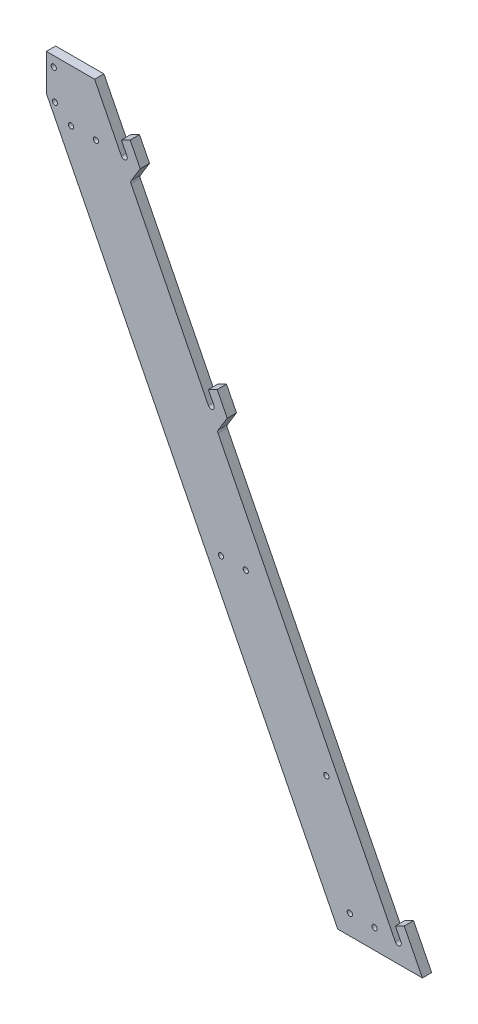
ISO-10303-21;
HEADER;
FILE_DESCRIPTION(('STEP AP214'),'2;1');
FILE_NAME('part.step','',(''),(''),'','','');
FILE_SCHEMA(('AUTOMOTIVE_DESIGN { 1 0 10303 214 1 1 1 1 }'));
ENDSEC;
DATA;
#1=APPLICATION_CONTEXT('core data for automotive mechanical design processes');
#2=APPLICATION_PROTOCOL_DEFINITION('international standard','automotive_design',2000,#1);
#3=PRODUCT_CONTEXT('',#1,'mechanical');
#4=PRODUCT('Part','Part','',(#3));
#5=PRODUCT_RELATED_PRODUCT_CATEGORY('part','',(#4));
#6=PRODUCT_DEFINITION_FORMATION('','',#4);
#7=PRODUCT_DEFINITION_CONTEXT('part definition',#1,'design');
#8=PRODUCT_DEFINITION('design','',#6,#7);
#9=PRODUCT_DEFINITION_SHAPE('','',#8);
#10=(LENGTH_UNIT() NAMED_UNIT(*) SI_UNIT(.MILLI.,.METRE.));
#11=(NAMED_UNIT(*) PLANE_ANGLE_UNIT() SI_UNIT($,.RADIAN.));
#12=(NAMED_UNIT(*) SI_UNIT($,.STERADIAN.) SOLID_ANGLE_UNIT());
#13=UNCERTAINTY_MEASURE_WITH_UNIT(LENGTH_MEASURE(1.E-05),#10,'distance_accuracy_value','');
#14=(GEOMETRIC_REPRESENTATION_CONTEXT(3) GLOBAL_UNCERTAINTY_ASSIGNED_CONTEXT((#13)) GLOBAL_UNIT_ASSIGNED_CONTEXT((#10,
#11,#12)) REPRESENTATION_CONTEXT('',''));
#15=CARTESIAN_POINT('',(0.,0.,0.));
#16=DIRECTION('',(0.,0.,1.));
#17=DIRECTION('',(1.,0.,0.));
#18=AXIS2_PLACEMENT_3D('',#15,#16,#17);
#19=CARTESIAN_POINT('',(0.,0.,5.953125));
#20=DIRECTION('',(-0.892982258418845,-0.450091864122402,0.));
#21=DIRECTION('',(0.450091864122402,-0.892982258418845,0.));
#22=AXIS2_PLACEMENT_3D('',#19,#20,#21);
#23=PLANE('',#22);
#24=DIRECTION('',(-0.450091864122402,0.892982258418845,0.));
#25=VECTOR('',#24,1.);
#26=CARTESIAN_POINT('',(0.,0.,5.953125));
#27=LINE('',#26,#25);
#28=CARTESIAN_POINT('',(-362.577999953873,719.354751908484,5.953125));
#29=VERTEX_POINT('',#28);
#30=CARTESIAN_POINT('',(-396.875,787.4,5.953125));
#31=VERTEX_POINT('',#30);
#32=EDGE_CURVE('E259',#29,#31,#27,.T.);
#33=ORIENTED_EDGE('',*,*,#32,.F.);
#34=DIRECTION('',(0.,0.,1.));
#35=VECTOR('',#34,1.);
#36=CARTESIAN_POINT('',(-362.577999953873,719.354751908484,-64.1233525596098));
#37=LINE('',#36,#35);
#38=CARTESIAN_POINT('',(-362.577999953873,719.354751908484,-5.953125));
#39=VERTEX_POINT('',#38);
#40=EDGE_CURVE('E213',#39,#29,#37,.T.);
#41=ORIENTED_EDGE('',*,*,#40,.F.);
#42=DIRECTION('',(-0.450091864122402,0.892982258418845,0.));
#43=VECTOR('',#42,1.);
#44=CARTESIAN_POINT('',(0.,0.,-5.953125));
#45=LINE('',#44,#43);
#46=CARTESIAN_POINT('',(-396.875,787.4,-5.953125));
#47=VERTEX_POINT('',#46);
#48=EDGE_CURVE('E273',#39,#47,#45,.T.);
#49=ORIENTED_EDGE('',*,*,#48,.T.);
#50=DIRECTION('',(0.,0.,-1.));
#51=VECTOR('',#50,1.);
#52=CARTESIAN_POINT('',(-396.875,787.4,5.953125));
#53=LINE('',#52,#51);
#54=EDGE_CURVE('E284',#31,#47,#53,.T.);
#55=ORIENTED_EDGE('',*,*,#54,.F.);
#56=EDGE_LOOP('',(#33,#41,#49,#55));
#57=FACE_BOUND('',#56,.T.);
#58=ADVANCED_FACE('F33',(#57),#23,.F.);
#59=CARTESIAN_POINT('',(-251.11274980396,498.207695611057,-5.953125));
#60=VERTEX_POINT('',#59);
#61=CARTESIAN_POINT('',(-350.296018325224,694.987300357244,-5.953125));
#62=VERTEX_POINT('',#61);
#63=EDGE_CURVE('E278',#60,#62,#45,.T.);
#64=ORIENTED_EDGE('',*,*,#63,.T.);
#65=DIRECTION('',(0.,0.,1.));
#66=VECTOR('',#65,1.);
#67=CARTESIAN_POINT('',(-350.296018325224,694.987300357244,5.953125));
#68=LINE('',#67,#66);
#69=CARTESIAN_POINT('',(-350.296018325224,694.987300357244,5.953125));
#70=VERTEX_POINT('',#69);
#71=EDGE_CURVE('E292',#62,#70,#68,.T.);
#72=ORIENTED_EDGE('',*,*,#71,.T.);
#73=CARTESIAN_POINT('',(-251.11274980396,498.207695611057,5.953125));
#74=VERTEX_POINT('',#73);
#75=EDGE_CURVE('E265',#74,#70,#27,.T.);
#76=ORIENTED_EDGE('',*,*,#75,.F.);
#77=DIRECTION('',(0.,0.,1.));
#78=VECTOR('',#77,1.);
#79=CARTESIAN_POINT('',(-251.11274980396,498.207695611057,-64.1233525596098));
#80=LINE('',#79,#78);
#81=EDGE_CURVE('E249',#60,#74,#80,.T.);
#82=ORIENTED_EDGE('',*,*,#81,.F.);
#83=EDGE_LOOP('',(#64,#72,#76,#82));
#84=FACE_BOUND('',#83,.T.);
#85=ADVANCED_FACE('F508',(#84),#23,.F.);
#86=CARTESIAN_POINT('',(-482.207042469604,787.4,5.953125));
#87=DIRECTION('',(0.892982258418845,0.450091864122402,0.));
#88=DIRECTION('',(-0.450091864122402,0.892982258418845,0.));
#89=AXIS2_PLACEMENT_3D('',#86,#87,#88);
#90=PLANE('',#89);
#91=DIRECTION('',(0.450091864122402,-0.892982258418845,0.));
#92=VECTOR('',#91,1.);
#93=CARTESIAN_POINT('',(-482.207042469604,787.4,5.953125));
#94=LINE('',#93,#92);
#95=CARTESIAN_POINT('',(-458.7875,740.935627740305,5.953125));
#96=VERTEX_POINT('',#95);
#97=CARTESIAN_POINT('',(-85.332042469604,-1.09287578986539E-13,5.953125));
#98=VERTEX_POINT('',#97);
#99=EDGE_CURVE('E268',#96,#98,#94,.T.);
#100=ORIENTED_EDGE('',*,*,#99,.F.);
#101=DIRECTION('',(0.,0.,1.));
#102=VECTOR('',#101,1.);
#103=CARTESIAN_POINT('',(-458.7875,740.935627740305,-5.953125));
#104=LINE('',#103,#102);
#105=CARTESIAN_POINT('',(-458.7875,740.935627740305,-5.953125));
#106=VERTEX_POINT('',#105);
#107=EDGE_CURVE('E197',#106,#96,#104,.T.);
#108=ORIENTED_EDGE('',*,*,#107,.F.);
#109=DIRECTION('',(0.450091864122402,-0.892982258418845,0.));
#110=VECTOR('',#109,1.);
#111=CARTESIAN_POINT('',(-482.207042469604,787.4,-5.953125));
#112=LINE('',#111,#110);
#113=CARTESIAN_POINT('',(-85.332042469604,-1.09287578986539E-13,-5.953125));
#114=VERTEX_POINT('',#113);
#115=EDGE_CURVE('E260',#106,#114,#112,.T.);
#116=ORIENTED_EDGE('',*,*,#115,.T.);
#117=DIRECTION('',(0.,0.,-1.));
#118=VECTOR('',#117,1.);
#119=CARTESIAN_POINT('',(-85.332042469604,-1.09287578986539E-13,5.953125));
#120=LINE('',#119,#118);
#121=EDGE_CURVE('E270',#98,#114,#120,.T.);
#122=ORIENTED_EDGE('',*,*,#121,.F.);
#123=EDGE_LOOP('',(#100,#108,#116,#122));
#124=FACE_BOUND('',#123,.T.);
#125=ADVANCED_FACE('F473',(#124),#90,.F.);
#126=CARTESIAN_POINT('',(0.,0.,5.953125));
#127=DIRECTION('',(0.,1.,0.));
#128=DIRECTION('',(-1.,0.,0.));
#129=AXIS2_PLACEMENT_3D('',#126,#127,#128);
#130=PLANE('',#129);
#131=DIRECTION('',(1.,0.,0.));
#132=VECTOR('',#131,1.);
#133=CARTESIAN_POINT('',(0.,0.,-5.953125));
#134=LINE('',#133,#132);
#135=CARTESIAN_POINT('',(23.1107615021854,0.,-5.953125));
#136=VERTEX_POINT('',#135);
#137=EDGE_CURVE('E237',#114,#136,#134,.T.);
#138=ORIENTED_EDGE('',*,*,#137,.T.);
#139=DIRECTION('',(0.,0.,1.));
#140=VECTOR('',#139,1.);
#141=CARTESIAN_POINT('',(23.1107615021854,0.,-64.1233525596098));
#142=LINE('',#141,#140);
#143=CARTESIAN_POINT('',(23.1107615021854,0.,5.953125));
#144=VERTEX_POINT('',#143);
#145=EDGE_CURVE('E422',#136,#144,#142,.T.);
#146=ORIENTED_EDGE('',*,*,#145,.T.);
#147=DIRECTION('',(1.,0.,0.));
#148=VECTOR('',#147,1.);
#149=CARTESIAN_POINT('',(0.,0.,5.953125));
#150=LINE('',#149,#148);
#151=EDGE_CURVE('E257',#98,#144,#150,.T.);
#152=ORIENTED_EDGE('',*,*,#151,.F.);
#153=ORIENTED_EDGE('',*,*,#121,.T.);
#154=EDGE_LOOP('',(#138,#146,#152,#153));
#155=FACE_BOUND('',#154,.T.);
#156=ADVANCED_FACE('F476',(#155),#130,.F.);
#157=CARTESIAN_POINT('',(-11.432333348709,22.6817493638388,-5.953125));
#158=VERTEX_POINT('',#157);
#159=CARTESIAN_POINT('',(-238.830768175311,473.840244059817,-5.953125));
#160=VERTEX_POINT('',#159);
#161=EDGE_CURVE('E274',#158,#160,#45,.T.);
#162=ORIENTED_EDGE('',*,*,#161,.T.);
#163=DIRECTION('',(0.,0.,1.));
#164=VECTOR('',#163,1.);
#165=CARTESIAN_POINT('',(-238.830768175311,473.840244059817,5.953125));
#166=LINE('',#165,#164);
#167=CARTESIAN_POINT('',(-238.830768175311,473.840244059817,5.953125));
#168=VERTEX_POINT('',#167);
#169=EDGE_CURVE('E287',#160,#168,#166,.T.);
#170=ORIENTED_EDGE('',*,*,#169,.T.);
#171=CARTESIAN_POINT('',(-11.432333348709,22.6817493638387,5.953125));
#172=VERTEX_POINT('',#171);
#173=EDGE_CURVE('E261',#172,#168,#27,.T.);
#174=ORIENTED_EDGE('',*,*,#173,.F.);
#175=DIRECTION('',(0.,0.,1.));
#176=VECTOR('',#175,1.);
#177=CARTESIAN_POINT('',(-11.432333348709,22.6817493638388,-64.1233525596098));
#178=LINE('',#177,#176);
#179=EDGE_CURVE('E311',#158,#172,#178,.T.);
#180=ORIENTED_EDGE('',*,*,#179,.F.);
#181=EDGE_LOOP('',(#162,#170,#174,#180));
#182=FACE_BOUND('',#181,.T.);
#183=ADVANCED_FACE('F309',(#182),#23,.F.);
#184=CARTESIAN_POINT('',(-396.875,787.4,5.953125));
#185=DIRECTION('',(0.,-1.,0.));
#186=DIRECTION('',(1.,0.,0.));
#187=AXIS2_PLACEMENT_3D('',#184,#185,#186);
#188=PLANE('',#187);
#189=DIRECTION('',(-1.,0.,0.));
#190=VECTOR('',#189,1.);
#191=CARTESIAN_POINT('',(-396.875,787.4,-5.953125));
#192=LINE('',#191,#190);
#193=CARTESIAN_POINT('',(-458.7875,787.4,-5.953125));
#194=VERTEX_POINT('',#193);
#195=EDGE_CURVE('E277',#47,#194,#192,.T.);
#196=ORIENTED_EDGE('',*,*,#195,.T.);
#197=DIRECTION('',(0.,0.,1.));
#198=VECTOR('',#197,1.);
#199=CARTESIAN_POINT('',(-458.7875,787.4,-5.953125));
#200=LINE('',#199,#198);
#201=CARTESIAN_POINT('',(-458.7875,787.4,5.953125));
#202=VERTEX_POINT('',#201);
#203=EDGE_CURVE('E353',#194,#202,#200,.T.);
#204=ORIENTED_EDGE('',*,*,#203,.T.);
#205=DIRECTION('',(-1.,0.,0.));
#206=VECTOR('',#205,1.);
#207=CARTESIAN_POINT('',(-396.875,787.4,5.953125));
#208=LINE('',#207,#206);
#209=EDGE_CURVE('E264',#31,#202,#208,.T.);
#210=ORIENTED_EDGE('',*,*,#209,.F.);
#211=ORIENTED_EDGE('',*,*,#54,.T.);
#212=EDGE_LOOP('',(#196,#204,#210,#211));
#213=FACE_BOUND('',#212,.T.);
#214=ADVANCED_FACE('F352',(#213),#188,.F.);
#215=CARTESIAN_POINT('',(0.,0.,5.953125));
#216=DIRECTION('',(0.,0.,1.));
#217=DIRECTION('',(1.,0.,0.));
#218=AXIS2_PLACEMENT_3D('',#215,#216,#217);
#219=PLANE('',#218);
#220=DIRECTION('',(-0.892982258418839,-0.450091864122414,0.));
#221=VECTOR('',#220,1.);
#222=CARTESIAN_POINT('',(-351.294286938697,742.819616106709,5.953125));
#223=LINE('',#222,#221);
#224=CARTESIAN_POINT('',(-351.294286938697,742.819616106709,5.953125));
#225=VERTEX_POINT('',#224);
#226=CARTESIAN_POINT('',(-362.635161620617,737.103449432355,5.953125));
#227=VERTEX_POINT('',#226);
#228=EDGE_CURVE('E189',#225,#227,#223,.T.);
#229=ORIENTED_EDGE('',*,*,#228,.T.);
#230=DIRECTION('',(0.450091864122414,-0.892982258418839,0.));
#231=VECTOR('',#230,1.);
#232=CARTESIAN_POINT('',(-355.489953277673,722.927356079956,5.953125));
#233=LINE('',#232,#231);
#234=CARTESIAN_POINT('',(-355.489953277673,722.927356079956,5.953125));
#235=VERTEX_POINT('',#234);
#236=EDGE_CURVE('E204',#227,#235,#233,.T.);
#237=ORIENTED_EDGE('',*,*,#236,.T.);
#238=CARTESIAN_POINT('',(-359.033976615773,721.14105399422,5.953125));
#239=DIRECTION('',(0.,0.,-1.));
#240=DIRECTION('',(-1.,0.,0.));
#241=AXIS2_PLACEMENT_3D('',#238,#239,#240);
#242=CIRCLE('',#241,3.96875000000003);
#243=EDGE_CURVE('E346',#235,#29,#242,.T.);
#244=ORIENTED_EDGE('',*,*,#243,.T.);
#245=ORIENTED_EDGE('',*,*,#32,.T.);
#246=ORIENTED_EDGE('',*,*,#209,.T.);
#247=DIRECTION('',(0.,1.,0.));
#248=VECTOR('',#247,1.);
#249=CARTESIAN_POINT('',(-458.7875,759.0536,5.953125));
#250=LINE('',#249,#248);
#251=EDGE_CURVE('E363',#96,#202,#250,.T.);
#252=ORIENTED_EDGE('',*,*,#251,.F.);
#253=ORIENTED_EDGE('',*,*,#99,.T.);
#254=ORIENTED_EDGE('',*,*,#151,.T.);
#255=DIRECTION('',(-0.450091864122415,0.892982258418839,0.));
#256=VECTOR('',#255,1.);
#257=CARTESIAN_POINT('',(1.28042133505488,43.3113948915844,5.953125));
#258=LINE('',#257,#256);
#259=CARTESIAN_POINT('',(-0.148620333533677,46.146613562064,5.953125));
#260=VERTEX_POINT('',#259);
#261=EDGE_CURVE('E415',#144,#260,#258,.T.);
#262=ORIENTED_EDGE('',*,*,#261,.T.);
#263=DIRECTION('',(-0.892982258418845,-0.450091864122403,0.));
#264=VECTOR('',#263,1.);
#265=CARTESIAN_POINT('',(-0.148620333533677,46.1466135620641,5.953125));
#266=LINE('',#265,#264);
#267=CARTESIAN_POINT('',(-11.4894950154527,40.4304468877097,5.953125));
#268=VERTEX_POINT('',#267);
#269=EDGE_CURVE('E444',#260,#268,#266,.T.);
#270=ORIENTED_EDGE('',*,*,#269,.T.);
#271=DIRECTION('',(0.450091864122409,-0.892982258418842,0.));
#272=VECTOR('',#271,1.);
#273=CARTESIAN_POINT('',(-4.34428667250944,26.2543535353105,5.953125));
#274=LINE('',#273,#272);
#275=CARTESIAN_POINT('',(-4.34428667250944,26.2543535353105,5.953125));
#276=VERTEX_POINT('',#275);
#277=EDGE_CURVE('E418',#268,#276,#274,.T.);
#278=ORIENTED_EDGE('',*,*,#277,.T.);
#279=CARTESIAN_POINT('',(-7.88831001060919,24.4680514495746,5.953125));
#280=DIRECTION('',(0.,0.,-1.));
#281=DIRECTION('',(-1.,0.,0.));
#282=AXIS2_PLACEMENT_3D('',#279,#280,#281);
#283=CIRCLE('',#282,3.96875000000002);
#284=EDGE_CURVE('E405',#276,#172,#283,.T.);
#285=ORIENTED_EDGE('',*,*,#284,.T.);
#286=ORIENTED_EDGE('',*,*,#173,.T.);
#287=CARTESIAN_POINT('',(-235.81409550992,475.360744395195,5.953125));
#288=DIRECTION('',(0.,0.,1.));
#289=DIRECTION('',(1.,0.,0.));
#290=AXIS2_PLACEMENT_3D('',#287,#288,#289);
#291=CIRCLE('',#290,3.3782);
#292=CARTESIAN_POINT('',(-238.6900726441,477.133028447957,5.953125));
#293=VERTEX_POINT('',#292);
#294=EDGE_CURVE('E296',#168,#293,#291,.F.);
#295=ORIENTED_EDGE('',*,*,#294,.T.);
#296=DIRECTION('',(0.52462377975301,0.851334182162132,0.));
#297=VECTOR('',#296,1.);
#298=CARTESIAN_POINT('',(-226.967661771487,496.155591774963,5.953125));
#299=LINE('',#298,#297);
#300=CARTESIAN_POINT('',(-226.967661771487,496.155591774963,5.953125));
#301=VERTEX_POINT('',#300);
#302=EDGE_CURVE('E241',#293,#301,#299,.T.);
#303=ORIENTED_EDGE('',*,*,#302,.T.);
#304=DIRECTION('',(-0.450091864122403,0.892982258418844,0.));
#305=VECTOR('',#304,1.);
#306=CARTESIAN_POINT('',(-238.399995120196,518.837341138803,5.953125));
#307=LINE('',#306,#305);
#308=CARTESIAN_POINT('',(-239.829036788785,521.672559809282,5.953125));
#309=VERTEX_POINT('',#308);
#310=EDGE_CURVE('E244',#301,#309,#307,.T.);
#311=ORIENTED_EDGE('',*,*,#310,.T.);
#312=DIRECTION('',(-0.892982258418838,-0.450091864122417,0.));
#313=VECTOR('',#312,1.);
#314=CARTESIAN_POINT('',(-239.829036788785,521.672559809282,5.953125));
#315=LINE('',#314,#313);
#316=CARTESIAN_POINT('',(-251.169911470704,515.956393134928,5.953125));
#317=VERTEX_POINT('',#316);
#318=EDGE_CURVE('E326',#309,#317,#315,.T.);
#319=ORIENTED_EDGE('',*,*,#318,.T.);
#320=DIRECTION('',(0.450091864122426,-0.892982258418833,0.));
#321=VECTOR('',#320,1.);
#322=CARTESIAN_POINT('',(-244.02470312776,501.780299782529,5.953125));
#323=LINE('',#322,#321);
#324=CARTESIAN_POINT('',(-244.02470312776,501.780299782529,5.953125));
#325=VERTEX_POINT('',#324);
#326=EDGE_CURVE('E247',#317,#325,#323,.T.);
#327=ORIENTED_EDGE('',*,*,#326,.T.);
#328=CARTESIAN_POINT('',(-247.56872646586,499.993997696793,5.953125));
#329=DIRECTION('',(0.,0.,-1.));
#330=DIRECTION('',(-1.,0.,0.));
#331=AXIS2_PLACEMENT_3D('',#328,#329,#330);
#332=CIRCLE('',#331,3.96875000000002);
#333=EDGE_CURVE('E238',#325,#74,#332,.T.);
#334=ORIENTED_EDGE('',*,*,#333,.T.);
#335=ORIENTED_EDGE('',*,*,#75,.T.);
#336=CARTESIAN_POINT('',(-347.279345659833,696.507800692622,5.953125));
#337=DIRECTION('',(0.,0.,1.));
#338=DIRECTION('',(1.,0.,0.));
#339=AXIS2_PLACEMENT_3D('',#336,#337,#338);
#340=CIRCLE('',#339,3.3782);
#341=CARTESIAN_POINT('',(-350.155322794013,698.280084745384,5.953125));
#342=VERTEX_POINT('',#341);
#343=EDGE_CURVE('E41',#70,#342,#340,.F.);
#344=ORIENTED_EDGE('',*,*,#343,.T.);
#345=DIRECTION('',(0.524623779753004,0.851334182162135,0.));
#346=VECTOR('',#345,1.);
#347=CARTESIAN_POINT('',(-338.4329119214,717.302648072391,5.953125));
#348=LINE('',#347,#346);
#349=CARTESIAN_POINT('',(-338.4329119214,717.302648072391,5.953125));
#350=VERTEX_POINT('',#349);
#351=EDGE_CURVE('E218',#342,#350,#348,.T.);
#352=ORIENTED_EDGE('',*,*,#351,.T.);
#353=DIRECTION('',(-0.45009186412241,0.892982258418841,0.));
#354=VECTOR('',#353,1.);
#355=CARTESIAN_POINT('',(-349.865245270109,739.98439743623,5.953125));
#356=LINE('',#355,#354);
#357=EDGE_CURVE('E207',#350,#225,#356,.T.);
#358=ORIENTED_EDGE('',*,*,#357,.T.);
#359=EDGE_LOOP('',(#229,#237,#244,#245,#246,#252,#253,#254,#262,#270,#278,#285,#286,#295,#303,
#311,#319,#327,#334,#335,#344,#352,#358));
#360=FACE_BOUND('',#359,.T.);
#361=CARTESIAN_POINT('',(-447.675,736.6,5.953125));
#362=DIRECTION('',(0.,0.,1.));
#363=DIRECTION('',(1.,0.,0.));
#364=AXIS2_PLACEMENT_3D('',#361,#362,#363);
#365=CIRCLE('',#364,3.3782);
#366=CARTESIAN_POINT('',(-444.2968,736.6,5.953125));
#367=VERTEX_POINT('',#366);
#368=EDGE_CURVE('E455',#367,#367,#365,.T.);
#369=ORIENTED_EDGE('',*,*,#368,.F.);
#370=EDGE_LOOP('',(#369));
#371=FACE_BOUND('',#370,.T.);
#372=CARTESIAN_POINT('',(-449.2625,774.7,5.953125));
#373=DIRECTION('',(0.,0.,1.));
#374=DIRECTION('',(1.,0.,0.));
#375=AXIS2_PLACEMENT_3D('',#372,#373,#374);
#376=CIRCLE('',#375,3.3782);
#377=CARTESIAN_POINT('',(-445.8843,774.7,5.953125));
#378=VERTEX_POINT('',#377);
#379=EDGE_CURVE('E461',#378,#378,#376,.T.);
#380=ORIENTED_EDGE('',*,*,#379,.F.);
#381=EDGE_LOOP('',(#380));
#382=FACE_BOUND('',#381,.T.);
#383=CARTESIAN_POINT('',(-99.9185934677166,162.967911885847,5.953125));
#384=DIRECTION('',(0.,0.,1.));
#385=DIRECTION('',(1.,0.,0.));
#386=AXIS2_PLACEMENT_3D('',#383,#384,#385);
#387=CIRCLE('',#386,3.37819999999998);
#388=CARTESIAN_POINT('',(-96.5403934677166,162.967911885847,5.953125));
#389=VERTEX_POINT('',#388);
#390=EDGE_CURVE('E357',#389,#389,#387,.T.);
#391=ORIENTED_EDGE('',*,*,#390,.F.);
#392=EDGE_LOOP('',(#391));
#393=FACE_BOUND('',#392,.T.);
#394=CARTESIAN_POINT('',(-427.0375,720.572600000001,5.953125));
#395=DIRECTION('',(0.,0.,1.));
#396=DIRECTION('',(1.,0.,0.));
#397=AXIS2_PLACEMENT_3D('',#394,#395,#396);
#398=CIRCLE('',#397,3.3782);
#399=CARTESIAN_POINT('',(-423.6593,720.572600000001,5.953125));
#400=VERTEX_POINT('',#399);
#401=EDGE_CURVE('E369',#400,#400,#398,.T.);
#402=ORIENTED_EDGE('',*,*,#401,.F.);
#403=EDGE_LOOP('',(#402));
#404=FACE_BOUND('',#403,.T.);
#405=CARTESIAN_POINT('',(-395.2875,720.572600000001,5.953125));
#406=DIRECTION('',(0.,0.,1.));
#407=DIRECTION('',(1.,0.,0.));
#408=AXIS2_PLACEMENT_3D('',#405,#406,#407);
#409=CIRCLE('',#408,3.3782);
#410=CARTESIAN_POINT('',(-391.9093,720.572600000001,5.953125));
#411=VERTEX_POINT('',#410);
#412=EDGE_CURVE('E375',#411,#411,#409,.T.);
#413=ORIENTED_EDGE('',*,*,#412,.F.);
#414=EDGE_LOOP('',(#413));
#415=FACE_BOUND('',#414,.T.);
#416=CARTESIAN_POINT('',(-203.2,339.471000000001,5.953125));
#417=DIRECTION('',(0.,0.,1.));
#418=DIRECTION('',(1.,0.,0.));
#419=AXIS2_PLACEMENT_3D('',#416,#417,#418);
#420=CIRCLE('',#419,3.3782);
#421=CARTESIAN_POINT('',(-199.8218,339.471000000001,5.953125));
#422=VERTEX_POINT('',#421);
#423=EDGE_CURVE('E381',#422,#422,#420,.T.);
#424=ORIENTED_EDGE('',*,*,#423,.F.);
#425=EDGE_LOOP('',(#424));
#426=FACE_BOUND('',#425,.T.);
#427=CARTESIAN_POINT('',(-234.95,339.471000000001,5.953125));
#428=DIRECTION('',(0.,0.,1.));
#429=DIRECTION('',(1.,0.,0.));
#430=AXIS2_PLACEMENT_3D('',#427,#428,#429);
#431=CIRCLE('',#430,3.3782);
#432=CARTESIAN_POINT('',(-231.5718,339.471000000001,5.953125));
#433=VERTEX_POINT('',#432);
#434=EDGE_CURVE('E387',#433,#433,#431,.T.);
#435=ORIENTED_EDGE('',*,*,#434,.F.);
#436=EDGE_LOOP('',(#435));
#437=FACE_BOUND('',#436,.T.);
#438=CARTESIAN_POINT('',(-69.85,25.3999999999999,5.953125));
#439=DIRECTION('',(0.,0.,1.));
#440=DIRECTION('',(1.,0.,0.));
#441=AXIS2_PLACEMENT_3D('',#438,#439,#440);
#442=CIRCLE('',#441,3.37819999999998);
#443=CARTESIAN_POINT('',(-66.4718,25.3999999999999,5.953125));
#444=VERTEX_POINT('',#443);
#445=EDGE_CURVE('E393',#444,#444,#442,.T.);
#446=ORIENTED_EDGE('',*,*,#445,.F.);
#447=EDGE_LOOP('',(#446));
#448=FACE_BOUND('',#447,.T.);
#449=CARTESIAN_POINT('',(-38.1,25.3999999999999,5.953125));
#450=DIRECTION('',(0.,0.,1.));
#451=DIRECTION('',(1.,0.,0.));
#452=AXIS2_PLACEMENT_3D('',#449,#450,#451);
#453=CIRCLE('',#452,3.37819999999998);
#454=CARTESIAN_POINT('',(-34.7218,25.3999999999999,5.953125));
#455=VERTEX_POINT('',#454);
#456=EDGE_CURVE('E399',#455,#455,#453,.T.);
#457=ORIENTED_EDGE('',*,*,#456,.F.);
#458=EDGE_LOOP('',(#457));
#459=FACE_BOUND('',#458,.T.);
#460=ADVANCED_FACE('F201',(#360,#371,#382,#393,#404,#415,#426,#437,#448,#459),#219,.T.);
#461=CARTESIAN_POINT('',(0.,0.,-5.953125));
#462=DIRECTION('',(0.,0.,1.));
#463=DIRECTION('',(1.,0.,0.));
#464=AXIS2_PLACEMENT_3D('',#461,#462,#463);
#465=PLANE('',#464);
#466=DIRECTION('',(-0.450091864122414,0.892982258418839,0.));
#467=VECTOR('',#466,1.);
#468=CARTESIAN_POINT('',(-355.489953277673,722.927356079956,-5.953125));
#469=LINE('',#468,#467);
#470=CARTESIAN_POINT('',(-355.489953277673,722.927356079956,-5.953125));
#471=VERTEX_POINT('',#470);
#472=CARTESIAN_POINT('',(-362.635161620617,737.103449432355,-5.953125));
#473=VERTEX_POINT('',#472);
#474=EDGE_CURVE('E429',#471,#473,#469,.T.);
#475=ORIENTED_EDGE('',*,*,#474,.T.);
#476=DIRECTION('',(-0.892982258418839,-0.450091864122414,0.));
#477=VECTOR('',#476,1.);
#478=CARTESIAN_POINT('',(-351.294286938697,742.819616106709,-5.953125));
#479=LINE('',#478,#477);
#480=CARTESIAN_POINT('',(-351.294286938697,742.819616106709,-5.953125));
#481=VERTEX_POINT('',#480);
#482=EDGE_CURVE('E192',#481,#473,#479,.T.);
#483=ORIENTED_EDGE('',*,*,#482,.F.);
#484=DIRECTION('',(0.45009186412241,-0.892982258418841,0.));
#485=VECTOR('',#484,1.);
#486=CARTESIAN_POINT('',(-349.865245270109,739.98439743623,-5.953125));
#487=LINE('',#486,#485);
#488=CARTESIAN_POINT('',(-338.4329119214,717.302648072391,-5.953125));
#489=VERTEX_POINT('',#488);
#490=EDGE_CURVE('E427',#481,#489,#487,.T.);
#491=ORIENTED_EDGE('',*,*,#490,.T.);
#492=DIRECTION('',(-0.524623779753004,-0.851334182162135,0.));
#493=VECTOR('',#492,1.);
#494=CARTESIAN_POINT('',(-338.4329119214,717.302648072391,-5.953125));
#495=LINE('',#494,#493);
#496=CARTESIAN_POINT('',(-350.155322794013,698.280084745384,-5.953125));
#497=VERTEX_POINT('',#496);
#498=EDGE_CURVE('E223',#489,#497,#495,.T.);
#499=ORIENTED_EDGE('',*,*,#498,.T.);
#500=CARTESIAN_POINT('',(-347.279345659833,696.507800692622,-5.953125));
#501=DIRECTION('',(0.,0.,1.));
#502=DIRECTION('',(1.,0.,0.));
#503=AXIS2_PLACEMENT_3D('',#500,#501,#502);
#504=CIRCLE('',#503,3.3782);
#505=EDGE_CURVE('E11',#497,#62,#504,.T.);
#506=ORIENTED_EDGE('',*,*,#505,.T.);
#507=ORIENTED_EDGE('',*,*,#63,.F.);
#508=CARTESIAN_POINT('',(-247.56872646586,499.993997696793,-5.953125));
#509=DIRECTION('',(0.,0.,1.));
#510=DIRECTION('',(1.,0.,0.));
#511=AXIS2_PLACEMENT_3D('',#508,#509,#510);
#512=CIRCLE('',#511,3.96875000000002);
#513=CARTESIAN_POINT('',(-244.02470312776,501.780299782529,-5.953125));
#514=VERTEX_POINT('',#513);
#515=EDGE_CURVE('E235',#60,#514,#512,.T.);
#516=ORIENTED_EDGE('',*,*,#515,.T.);
#517=DIRECTION('',(-0.450091864122426,0.892982258418833,0.));
#518=VECTOR('',#517,1.);
#519=CARTESIAN_POINT('',(-244.02470312776,501.780299782529,-5.953125));
#520=LINE('',#519,#518);
#521=CARTESIAN_POINT('',(-251.169911470704,515.956393134928,-5.953125));
#522=VERTEX_POINT('',#521);
#523=EDGE_CURVE('E232',#514,#522,#520,.T.);
#524=ORIENTED_EDGE('',*,*,#523,.T.);
#525=DIRECTION('',(-0.892982258418838,-0.450091864122417,0.));
#526=VECTOR('',#525,1.);
#527=CARTESIAN_POINT('',(-239.829036788785,521.672559809282,-5.953125));
#528=LINE('',#527,#526);
#529=CARTESIAN_POINT('',(-239.829036788785,521.672559809282,-5.953125));
#530=VERTEX_POINT('',#529);
#531=EDGE_CURVE('E329',#530,#522,#528,.T.);
#532=ORIENTED_EDGE('',*,*,#531,.F.);
#533=DIRECTION('',(0.450091864122403,-0.892982258418844,0.));
#534=VECTOR('',#533,1.);
#535=CARTESIAN_POINT('',(-238.399995120196,518.837341138803,-5.953125));
#536=LINE('',#535,#534);
#537=CARTESIAN_POINT('',(-226.967661771487,496.155591774963,-5.953125));
#538=VERTEX_POINT('',#537);
#539=EDGE_CURVE('E229',#530,#538,#536,.T.);
#540=ORIENTED_EDGE('',*,*,#539,.T.);
#541=DIRECTION('',(-0.52462377975301,-0.851334182162132,0.));
#542=VECTOR('',#541,1.);
#543=CARTESIAN_POINT('',(-226.967661771487,496.155591774963,-5.953125));
#544=LINE('',#543,#542);
#545=CARTESIAN_POINT('',(-238.6900726441,477.133028447957,-5.953125));
#546=VERTEX_POINT('',#545);
#547=EDGE_CURVE('E226',#538,#546,#544,.T.);
#548=ORIENTED_EDGE('',*,*,#547,.T.);
#549=CARTESIAN_POINT('',(-235.81409550992,475.360744395195,-5.953125));
#550=DIRECTION('',(0.,0.,1.));
#551=DIRECTION('',(1.,0.,0.));
#552=AXIS2_PLACEMENT_3D('',#549,#550,#551);
#553=CIRCLE('',#552,3.3782);
#554=EDGE_CURVE('E298',#546,#160,#553,.T.);
#555=ORIENTED_EDGE('',*,*,#554,.T.);
#556=ORIENTED_EDGE('',*,*,#161,.F.);
#557=CARTESIAN_POINT('',(-7.88831001060919,24.4680514495746,-5.953125));
#558=DIRECTION('',(0.,0.,1.));
#559=DIRECTION('',(1.,0.,0.));
#560=AXIS2_PLACEMENT_3D('',#557,#558,#559);
#561=CIRCLE('',#560,3.96875000000002);
#562=CARTESIAN_POINT('',(-4.34428667250944,26.2543535353105,-5.953125));
#563=VERTEX_POINT('',#562);
#564=EDGE_CURVE('E412',#158,#563,#561,.T.);
#565=ORIENTED_EDGE('',*,*,#564,.T.);
#566=DIRECTION('',(-0.450091864122409,0.892982258418842,0.));
#567=VECTOR('',#566,1.);
#568=CARTESIAN_POINT('',(-4.34428667250944,26.2543535353105,-5.953125));
#569=LINE('',#568,#567);
#570=CARTESIAN_POINT('',(-11.4894950154527,40.4304468877097,-5.953125));
#571=VERTEX_POINT('',#570);
#572=EDGE_CURVE('E408',#563,#571,#569,.T.);
#573=ORIENTED_EDGE('',*,*,#572,.T.);
#574=DIRECTION('',(-0.892982258418845,-0.450091864122403,0.));
#575=VECTOR('',#574,1.);
#576=CARTESIAN_POINT('',(-0.148620333533677,46.1466135620641,-5.953125));
#577=LINE('',#576,#575);
#578=CARTESIAN_POINT('',(-0.148620333533677,46.1466135620641,-5.953125));
#579=VERTEX_POINT('',#578);
#580=EDGE_CURVE('E448',#579,#571,#577,.T.);
#581=ORIENTED_EDGE('',*,*,#580,.F.);
#582=DIRECTION('',(0.450091864122415,-0.892982258418839,0.));
#583=VECTOR('',#582,1.);
#584=CARTESIAN_POINT('',(1.28042133505488,43.3113948915844,-5.953125));
#585=LINE('',#584,#583);
#586=EDGE_CURVE('E406',#579,#136,#585,.T.);
#587=ORIENTED_EDGE('',*,*,#586,.T.);
#588=ORIENTED_EDGE('',*,*,#137,.F.);
#589=ORIENTED_EDGE('',*,*,#115,.F.);
#590=DIRECTION('',(0.,1.,0.));
#591=VECTOR('',#590,1.);
#592=CARTESIAN_POINT('',(-458.7875,759.0536,-5.953125));
#593=LINE('',#592,#591);
#594=EDGE_CURVE('E358',#106,#194,#593,.T.);
#595=ORIENTED_EDGE('',*,*,#594,.T.);
#596=ORIENTED_EDGE('',*,*,#195,.F.);
#597=ORIENTED_EDGE('',*,*,#48,.F.);
#598=CARTESIAN_POINT('',(-359.033976615773,721.14105399422,-5.953125));
#599=DIRECTION('',(0.,0.,1.));
#600=DIRECTION('',(1.,0.,0.));
#601=AXIS2_PLACEMENT_3D('',#598,#599,#600);
#602=CIRCLE('',#601,3.96875000000003);
#603=EDGE_CURVE('E242',#39,#471,#602,.T.);
#604=ORIENTED_EDGE('',*,*,#603,.T.);
#605=EDGE_LOOP('',(#475,#483,#491,#499,#506,#507,#516,#524,#532,#540,#548,#555,#556,#565,#573,
#581,#587,#588,#589,#595,#596,#597,#604));
#606=FACE_BOUND('',#605,.T.);
#607=CARTESIAN_POINT('',(-447.675,736.6,-5.953125));
#608=DIRECTION('',(0.,0.,1.));
#609=DIRECTION('',(1.,0.,0.));
#610=AXIS2_PLACEMENT_3D('',#607,#608,#609);
#611=CIRCLE('',#610,3.3782);
#612=CARTESIAN_POINT('',(-444.2968,736.6,-5.953125));
#613=VERTEX_POINT('',#612);
#614=EDGE_CURVE('E458',#613,#613,#611,.T.);
#615=ORIENTED_EDGE('',*,*,#614,.T.);
#616=EDGE_LOOP('',(#615));
#617=FACE_BOUND('',#616,.T.);
#618=CARTESIAN_POINT('',(-449.2625,774.7,-5.953125));
#619=DIRECTION('',(0.,0.,1.));
#620=DIRECTION('',(1.,0.,0.));
#621=AXIS2_PLACEMENT_3D('',#618,#619,#620);
#622=CIRCLE('',#621,3.3782);
#623=CARTESIAN_POINT('',(-445.8843,774.7,-5.953125));
#624=VERTEX_POINT('',#623);
#625=EDGE_CURVE('E464',#624,#624,#622,.T.);
#626=ORIENTED_EDGE('',*,*,#625,.T.);
#627=EDGE_LOOP('',(#626));
#628=FACE_BOUND('',#627,.T.);
#629=CARTESIAN_POINT('',(-99.9185934677166,162.967911885847,-5.953125));
#630=DIRECTION('',(0.,0.,1.));
#631=DIRECTION('',(1.,0.,0.));
#632=AXIS2_PLACEMENT_3D('',#629,#630,#631);
#633=CIRCLE('',#632,3.3782);
#634=CARTESIAN_POINT('',(-96.5403934677166,162.967911885847,-5.953125));
#635=VERTEX_POINT('',#634);
#636=EDGE_CURVE('E361',#635,#635,#633,.T.);
#637=ORIENTED_EDGE('',*,*,#636,.T.);
#638=EDGE_LOOP('',(#637));
#639=FACE_BOUND('',#638,.T.);
#640=CARTESIAN_POINT('',(-427.0375,720.572600000001,-5.953125));
#641=DIRECTION('',(0.,0.,1.));
#642=DIRECTION('',(1.,0.,0.));
#643=AXIS2_PLACEMENT_3D('',#640,#641,#642);
#644=CIRCLE('',#643,3.3782);
#645=CARTESIAN_POINT('',(-423.6593,720.572600000001,-5.953125));
#646=VERTEX_POINT('',#645);
#647=EDGE_CURVE('E372',#646,#646,#644,.T.);
#648=ORIENTED_EDGE('',*,*,#647,.T.);
#649=EDGE_LOOP('',(#648));
#650=FACE_BOUND('',#649,.T.);
#651=CARTESIAN_POINT('',(-395.2875,720.572600000001,-5.953125));
#652=DIRECTION('',(0.,0.,1.));
#653=DIRECTION('',(1.,0.,0.));
#654=AXIS2_PLACEMENT_3D('',#651,#652,#653);
#655=CIRCLE('',#654,3.3782);
#656=CARTESIAN_POINT('',(-391.9093,720.572600000001,-5.953125));
#657=VERTEX_POINT('',#656);
#658=EDGE_CURVE('E378',#657,#657,#655,.T.);
#659=ORIENTED_EDGE('',*,*,#658,.T.);
#660=EDGE_LOOP('',(#659));
#661=FACE_BOUND('',#660,.T.);
#662=CARTESIAN_POINT('',(-203.2,339.471000000001,-5.953125));
#663=DIRECTION('',(0.,0.,1.));
#664=DIRECTION('',(1.,0.,0.));
#665=AXIS2_PLACEMENT_3D('',#662,#663,#664);
#666=CIRCLE('',#665,3.3782);
#667=CARTESIAN_POINT('',(-199.8218,339.471000000001,-5.953125));
#668=VERTEX_POINT('',#667);
#669=EDGE_CURVE('E384',#668,#668,#666,.T.);
#670=ORIENTED_EDGE('',*,*,#669,.T.);
#671=EDGE_LOOP('',(#670));
#672=FACE_BOUND('',#671,.T.);
#673=CARTESIAN_POINT('',(-234.95,339.471000000001,-5.953125));
#674=DIRECTION('',(0.,0.,1.));
#675=DIRECTION('',(1.,0.,0.));
#676=AXIS2_PLACEMENT_3D('',#673,#674,#675);
#677=CIRCLE('',#676,3.3782);
#678=CARTESIAN_POINT('',(-231.5718,339.471000000001,-5.953125));
#679=VERTEX_POINT('',#678);
#680=EDGE_CURVE('E390',#679,#679,#677,.T.);
#681=ORIENTED_EDGE('',*,*,#680,.T.);
#682=EDGE_LOOP('',(#681));
#683=FACE_BOUND('',#682,.T.);
#684=CARTESIAN_POINT('',(-69.85,25.3999999999999,-5.953125));
#685=DIRECTION('',(0.,0.,1.));
#686=DIRECTION('',(1.,0.,0.));
#687=AXIS2_PLACEMENT_3D('',#684,#685,#686);
#688=CIRCLE('',#687,3.3782);
#689=CARTESIAN_POINT('',(-66.4718,25.3999999999999,-5.953125));
#690=VERTEX_POINT('',#689);
#691=EDGE_CURVE('E396',#690,#690,#688,.T.);
#692=ORIENTED_EDGE('',*,*,#691,.T.);
#693=EDGE_LOOP('',(#692));
#694=FACE_BOUND('',#693,.T.);
#695=CARTESIAN_POINT('',(-38.1,25.3999999999999,-5.953125));
#696=DIRECTION('',(0.,0.,1.));
#697=DIRECTION('',(1.,0.,0.));
#698=AXIS2_PLACEMENT_3D('',#695,#696,#697);
#699=CIRCLE('',#698,3.3782);
#700=CARTESIAN_POINT('',(-34.7218,25.3999999999999,-5.953125));
#701=VERTEX_POINT('',#700);
#702=EDGE_CURVE('E402',#701,#701,#699,.T.);
#703=ORIENTED_EDGE('',*,*,#702,.T.);
#704=EDGE_LOOP('',(#703));
#705=FACE_BOUND('',#704,.T.);
#706=ADVANCED_FACE('F301',(#606,#617,#628,#639,#650,#661,#672,#683,#694,#705),#465,.F.);
#707=CARTESIAN_POINT('',(-247.56872646586,499.993997696793,-64.1233525596098));
#708=DIRECTION('',(0.,0.,1.));
#709=DIRECTION('',(1.,0.,0.));
#710=AXIS2_PLACEMENT_3D('',#707,#708,#709);
#711=CYLINDRICAL_SURFACE('',#710,3.96875000000002);
#712=ORIENTED_EDGE('',*,*,#515,.F.);
#713=ORIENTED_EDGE('',*,*,#81,.T.);
#714=ORIENTED_EDGE('',*,*,#333,.F.);
#715=DIRECTION('',(0.,0.,1.));
#716=VECTOR('',#715,1.);
#717=CARTESIAN_POINT('',(-244.02470312776,501.780299782529,-64.1233525596098));
#718=LINE('',#717,#716);
#719=EDGE_CURVE('E230',#514,#325,#718,.T.);
#720=ORIENTED_EDGE('',*,*,#719,.F.);
#721=EDGE_LOOP('',(#712,#713,#714,#720));
#722=FACE_BOUND('',#721,.T.);
#723=ADVANCED_FACE('F340',(#722),#711,.F.);
#724=CARTESIAN_POINT('',(-244.02470312776,501.780299782529,-64.1233525596098));
#725=DIRECTION('',(-0.892982258418833,-0.450091864122426,0.));
#726=DIRECTION('',(0.450091864122426,-0.892982258418833,0.));
#727=AXIS2_PLACEMENT_3D('',#724,#725,#726);
#728=PLANE('',#727);
#729=DIRECTION('',(0.,0.,-1.));
#730=VECTOR('',#729,1.);
#731=CARTESIAN_POINT('',(-251.169911470704,515.956393134928,5.953125));
#732=LINE('',#731,#730);
#733=EDGE_CURVE('E335',#317,#522,#732,.T.);
#734=ORIENTED_EDGE('',*,*,#733,.T.);
#735=ORIENTED_EDGE('',*,*,#523,.F.);
#736=ORIENTED_EDGE('',*,*,#719,.T.);
#737=ORIENTED_EDGE('',*,*,#326,.F.);
#738=EDGE_LOOP('',(#734,#735,#736,#737));
#739=FACE_BOUND('',#738,.T.);
#740=ADVANCED_FACE('F333',(#739),#728,.T.);
#741=CARTESIAN_POINT('',(-238.399995120196,518.837341138803,-64.1233525596098));
#742=DIRECTION('',(0.892982258418844,0.450091864122403,0.));
#743=DIRECTION('',(-0.450091864122403,0.892982258418844,0.));
#744=AXIS2_PLACEMENT_3D('',#741,#742,#743);
#745=PLANE('',#744);
#746=DIRECTION('',(0.,0.,-1.));
#747=VECTOR('',#746,1.);
#748=CARTESIAN_POINT('',(-239.829036788785,521.672559809282,5.953125));
#749=LINE('',#748,#747);
#750=EDGE_CURVE('E324',#309,#530,#749,.T.);
#751=ORIENTED_EDGE('',*,*,#750,.F.);
#752=ORIENTED_EDGE('',*,*,#310,.F.);
#753=DIRECTION('',(0.,0.,1.));
#754=VECTOR('',#753,1.);
#755=CARTESIAN_POINT('',(-226.967661771487,496.155591774963,-64.1233525596098));
#756=LINE('',#755,#754);
#757=EDGE_CURVE('E252',#538,#301,#756,.T.);
#758=ORIENTED_EDGE('',*,*,#757,.F.);
#759=ORIENTED_EDGE('',*,*,#539,.F.);
#760=EDGE_LOOP('',(#751,#752,#758,#759));
#761=FACE_BOUND('',#760,.T.);
#762=ADVANCED_FACE('F323',(#761),#745,.T.);
#763=CARTESIAN_POINT('',(-226.967661771487,496.155591774963,-64.1233525596098));
#764=DIRECTION('',(0.851334182162132,-0.52462377975301,0.));
#765=DIRECTION('',(0.52462377975301,0.851334182162132,0.));
#766=AXIS2_PLACEMENT_3D('',#763,#764,#765);
#767=PLANE('',#766);
#768=ORIENTED_EDGE('',*,*,#302,.F.);
#769=DIRECTION('',(0.,0.,1.));
#770=VECTOR('',#769,1.);
#771=CARTESIAN_POINT('',(-238.6900726441,477.133028447957,-64.1233525596098));
#772=LINE('',#771,#770);
#773=EDGE_CURVE('E290',#293,#546,#772,.F.);
#774=ORIENTED_EDGE('',*,*,#773,.T.);
#775=ORIENTED_EDGE('',*,*,#547,.F.);
#776=ORIENTED_EDGE('',*,*,#757,.T.);
#777=EDGE_LOOP('',(#768,#774,#775,#776));
#778=FACE_BOUND('',#777,.T.);
#779=ADVANCED_FACE('F317',(#778),#767,.T.);
#780=CARTESIAN_POINT('',(-359.033976615773,721.14105399422,-64.1233525596098));
#781=DIRECTION('',(0.,0.,1.));
#782=DIRECTION('',(1.,0.,0.));
#783=AXIS2_PLACEMENT_3D('',#780,#781,#782);
#784=CYLINDRICAL_SURFACE('',#783,3.96875000000003);
#785=ORIENTED_EDGE('',*,*,#603,.F.);
#786=ORIENTED_EDGE('',*,*,#40,.T.);
#787=ORIENTED_EDGE('',*,*,#243,.F.);
#788=DIRECTION('',(0.,0.,1.));
#789=VECTOR('',#788,1.);
#790=CARTESIAN_POINT('',(-355.489953277673,722.927356079956,-64.1233525596098));
#791=LINE('',#790,#789);
#792=EDGE_CURVE('E211',#471,#235,#791,.T.);
#793=ORIENTED_EDGE('',*,*,#792,.F.);
#794=EDGE_LOOP('',(#785,#786,#787,#793));
#795=FACE_BOUND('',#794,.T.);
#796=ADVANCED_FACE('F538',(#795),#784,.F.);
#797=CARTESIAN_POINT('',(-355.489953277673,722.927356079956,-64.1233525596098));
#798=DIRECTION('',(-0.892982258418839,-0.450091864122414,0.));
#799=DIRECTION('',(0.450091864122414,-0.892982258418839,0.));
#800=AXIS2_PLACEMENT_3D('',#797,#798,#799);
#801=PLANE('',#800);
#802=DIRECTION('',(0.,0.,-1.));
#803=VECTOR('',#802,1.);
#804=CARTESIAN_POINT('',(-362.635161620617,737.103449432355,5.953125));
#805=LINE('',#804,#803);
#806=EDGE_CURVE('E186',#227,#473,#805,.T.);
#807=ORIENTED_EDGE('',*,*,#806,.T.);
#808=ORIENTED_EDGE('',*,*,#474,.F.);
#809=ORIENTED_EDGE('',*,*,#792,.T.);
#810=ORIENTED_EDGE('',*,*,#236,.F.);
#811=EDGE_LOOP('',(#807,#808,#809,#810));
#812=FACE_BOUND('',#811,.T.);
#813=ADVANCED_FACE('F209',(#812),#801,.T.);
#814=CARTESIAN_POINT('',(-349.865245270109,739.98439743623,-64.1233525596098));
#815=DIRECTION('',(0.892982258418841,0.45009186412241,0.));
#816=DIRECTION('',(-0.45009186412241,0.892982258418841,0.));
#817=AXIS2_PLACEMENT_3D('',#814,#815,#816);
#818=PLANE('',#817);
#819=DIRECTION('',(0.,0.,-1.));
#820=VECTOR('',#819,1.);
#821=CARTESIAN_POINT('',(-351.294286938697,742.819616106709,5.953125));
#822=LINE('',#821,#820);
#823=EDGE_CURVE('E198',#225,#481,#822,.T.);
#824=ORIENTED_EDGE('',*,*,#823,.F.);
#825=ORIENTED_EDGE('',*,*,#357,.F.);
#826=DIRECTION('',(0.,0.,1.));
#827=VECTOR('',#826,1.);
#828=CARTESIAN_POINT('',(-338.4329119214,717.302648072391,-64.1233525596098));
#829=LINE('',#828,#827);
#830=EDGE_CURVE('E216',#489,#350,#829,.T.);
#831=ORIENTED_EDGE('',*,*,#830,.F.);
#832=ORIENTED_EDGE('',*,*,#490,.F.);
#833=EDGE_LOOP('',(#824,#825,#831,#832));
#834=FACE_BOUND('',#833,.T.);
#835=ADVANCED_FACE('F436',(#834),#818,.T.);
#836=CARTESIAN_POINT('',(-338.4329119214,717.302648072391,-64.1233525596098));
#837=DIRECTION('',(0.851334182162135,-0.524623779753004,0.));
#838=DIRECTION('',(0.524623779753004,0.851334182162135,0.));
#839=AXIS2_PLACEMENT_3D('',#836,#837,#838);
#840=PLANE('',#839);
#841=ORIENTED_EDGE('',*,*,#351,.F.);
#842=DIRECTION('',(0.,0.,1.));
#843=VECTOR('',#842,1.);
#844=CARTESIAN_POINT('',(-350.155322794013,698.280084745384,-64.1233525596098));
#845=LINE('',#844,#843);
#846=EDGE_CURVE('E54',#342,#497,#845,.F.);
#847=ORIENTED_EDGE('',*,*,#846,.T.);
#848=ORIENTED_EDGE('',*,*,#498,.F.);
#849=ORIENTED_EDGE('',*,*,#830,.T.);
#850=EDGE_LOOP('',(#841,#847,#848,#849));
#851=FACE_BOUND('',#850,.T.);
#852=ADVANCED_FACE('F433',(#851),#840,.T.);
#853=CARTESIAN_POINT('',(-7.88831001060919,24.4680514495746,-64.1233525596098));
#854=DIRECTION('',(0.,0.,1.));
#855=DIRECTION('',(1.,0.,0.));
#856=AXIS2_PLACEMENT_3D('',#853,#854,#855);
#857=CYLINDRICAL_SURFACE('',#856,3.96875000000002);
#858=ORIENTED_EDGE('',*,*,#564,.F.);
#859=ORIENTED_EDGE('',*,*,#179,.T.);
#860=ORIENTED_EDGE('',*,*,#284,.F.);
#861=DIRECTION('',(0.,0.,1.));
#862=VECTOR('',#861,1.);
#863=CARTESIAN_POINT('',(-4.34428667250944,26.2543535353105,-64.1233525596098));
#864=LINE('',#863,#862);
#865=EDGE_CURVE('E409',#563,#276,#864,.T.);
#866=ORIENTED_EDGE('',*,*,#865,.F.);
#867=EDGE_LOOP('',(#858,#859,#860,#866));
#868=FACE_BOUND('',#867,.T.);
#869=ADVANCED_FACE('F491',(#868),#857,.F.);
#870=CARTESIAN_POINT('',(-4.34428667250944,26.2543535353105,-64.1233525596098));
#871=DIRECTION('',(-0.892982258418842,-0.450091864122409,0.));
#872=DIRECTION('',(0.450091864122409,-0.892982258418842,0.));
#873=AXIS2_PLACEMENT_3D('',#870,#871,#872);
#874=PLANE('',#873);
#875=DIRECTION('',(0.,0.,-1.));
#876=VECTOR('',#875,1.);
#877=CARTESIAN_POINT('',(-11.4894950154527,40.4304468877097,5.953125));
#878=LINE('',#877,#876);
#879=EDGE_CURVE('E441',#268,#571,#878,.T.);
#880=ORIENTED_EDGE('',*,*,#879,.T.);
#881=ORIENTED_EDGE('',*,*,#572,.F.);
#882=ORIENTED_EDGE('',*,*,#865,.T.);
#883=ORIENTED_EDGE('',*,*,#277,.F.);
#884=EDGE_LOOP('',(#880,#881,#882,#883));
#885=FACE_BOUND('',#884,.T.);
#886=ADVANCED_FACE('F486',(#885),#874,.T.);
#887=CARTESIAN_POINT('',(1.28042133505488,43.3113948915844,-64.1233525596098));
#888=DIRECTION('',(0.892982258418839,0.450091864122415,0.));
#889=DIRECTION('',(-0.450091864122415,0.892982258418839,0.));
#890=AXIS2_PLACEMENT_3D('',#887,#888,#889);
#891=PLANE('',#890);
#892=DIRECTION('',(0.,0.,-1.));
#893=VECTOR('',#892,1.);
#894=CARTESIAN_POINT('',(-0.148620333533677,46.1466135620641,5.953125));
#895=LINE('',#894,#893);
#896=EDGE_CURVE('E447',#260,#579,#895,.T.);
#897=ORIENTED_EDGE('',*,*,#896,.F.);
#898=ORIENTED_EDGE('',*,*,#261,.F.);
#899=ORIENTED_EDGE('',*,*,#145,.F.);
#900=ORIENTED_EDGE('',*,*,#586,.F.);
#901=EDGE_LOOP('',(#897,#898,#899,#900));
#902=FACE_BOUND('',#901,.T.);
#903=ADVANCED_FACE('F482',(#902),#891,.T.);
#904=CARTESIAN_POINT('',(-38.1,25.3999999999999,5.953125));
#905=DIRECTION('',(0.,0.,1.));
#906=DIRECTION('',(1.,0.,0.));
#907=AXIS2_PLACEMENT_3D('',#904,#905,#906);
#908=CYLINDRICAL_SURFACE('',#907,3.37819999999999);
#909=ORIENTED_EDGE('',*,*,#702,.F.);
#910=EDGE_LOOP('',(#909));
#911=FACE_BOUND('',#910,.T.);
#912=ORIENTED_EDGE('',*,*,#456,.T.);
#913=EDGE_LOOP('',(#912));
#914=FACE_BOUND('',#913,.T.);
#915=ADVANCED_FACE('F629',(#911,#914),#908,.F.);
#916=CARTESIAN_POINT('',(-69.85,25.3999999999999,5.953125));
#917=DIRECTION('',(0.,0.,1.));
#918=DIRECTION('',(1.,0.,0.));
#919=AXIS2_PLACEMENT_3D('',#916,#917,#918);
#920=CYLINDRICAL_SURFACE('',#919,3.37819999999999);
#921=ORIENTED_EDGE('',*,*,#691,.F.);
#922=EDGE_LOOP('',(#921));
#923=FACE_BOUND('',#922,.T.);
#924=ORIENTED_EDGE('',*,*,#445,.T.);
#925=EDGE_LOOP('',(#924));
#926=FACE_BOUND('',#925,.T.);
#927=ADVANCED_FACE('F782',(#923,#926),#920,.F.);
#928=CARTESIAN_POINT('',(-234.95,339.471000000001,5.953125));
#929=DIRECTION('',(0.,0.,1.));
#930=DIRECTION('',(1.,0.,0.));
#931=AXIS2_PLACEMENT_3D('',#928,#929,#930);
#932=CYLINDRICAL_SURFACE('',#931,3.3782);
#933=ORIENTED_EDGE('',*,*,#680,.F.);
#934=EDGE_LOOP('',(#933));
#935=FACE_BOUND('',#934,.T.);
#936=ORIENTED_EDGE('',*,*,#434,.T.);
#937=EDGE_LOOP('',(#936));
#938=FACE_BOUND('',#937,.T.);
#939=ADVANCED_FACE('F772',(#935,#938),#932,.F.);
#940=CARTESIAN_POINT('',(-203.2,339.471000000001,5.953125));
#941=DIRECTION('',(0.,0.,1.));
#942=DIRECTION('',(1.,0.,0.));
#943=AXIS2_PLACEMENT_3D('',#940,#941,#942);
#944=CYLINDRICAL_SURFACE('',#943,3.3782);
#945=ORIENTED_EDGE('',*,*,#669,.F.);
#946=EDGE_LOOP('',(#945));
#947=FACE_BOUND('',#946,.T.);
#948=ORIENTED_EDGE('',*,*,#423,.T.);
#949=EDGE_LOOP('',(#948));
#950=FACE_BOUND('',#949,.T.);
#951=ADVANCED_FACE('F762',(#947,#950),#944,.F.);
#952=CARTESIAN_POINT('',(-395.2875,720.572600000001,5.953125));
#953=DIRECTION('',(0.,0.,1.));
#954=DIRECTION('',(1.,0.,0.));
#955=AXIS2_PLACEMENT_3D('',#952,#953,#954);
#956=CYLINDRICAL_SURFACE('',#955,3.3782);
#957=ORIENTED_EDGE('',*,*,#658,.F.);
#958=EDGE_LOOP('',(#957));
#959=FACE_BOUND('',#958,.T.);
#960=ORIENTED_EDGE('',*,*,#412,.T.);
#961=EDGE_LOOP('',(#960));
#962=FACE_BOUND('',#961,.T.);
#963=ADVANCED_FACE('F752',(#959,#962),#956,.F.);
#964=CARTESIAN_POINT('',(-427.0375,720.572600000001,5.953125));
#965=DIRECTION('',(0.,0.,1.));
#966=DIRECTION('',(1.,0.,0.));
#967=AXIS2_PLACEMENT_3D('',#964,#965,#966);
#968=CYLINDRICAL_SURFACE('',#967,3.3782);
#969=ORIENTED_EDGE('',*,*,#647,.F.);
#970=EDGE_LOOP('',(#969));
#971=FACE_BOUND('',#970,.T.);
#972=ORIENTED_EDGE('',*,*,#401,.T.);
#973=EDGE_LOOP('',(#972));
#974=FACE_BOUND('',#973,.T.);
#975=ADVANCED_FACE('F744',(#971,#974),#968,.F.);
#976=CARTESIAN_POINT('',(-99.9185934677166,162.967911885847,5.953125));
#977=DIRECTION('',(0.,0.,1.));
#978=DIRECTION('',(1.,0.,0.));
#979=AXIS2_PLACEMENT_3D('',#976,#977,#978);
#980=CYLINDRICAL_SURFACE('',#979,3.37819999999999);
#981=ORIENTED_EDGE('',*,*,#636,.F.);
#982=EDGE_LOOP('',(#981));
#983=FACE_BOUND('',#982,.T.);
#984=ORIENTED_EDGE('',*,*,#390,.T.);
#985=EDGE_LOOP('',(#984));
#986=FACE_BOUND('',#985,.T.);
#987=ADVANCED_FACE('F716',(#983,#986),#980,.F.);
#988=CARTESIAN_POINT('',(-458.7875,759.0536,-5.953125));
#989=DIRECTION('',(1.,0.,0.));
#990=DIRECTION('',(0.,0.,-1.));
#991=AXIS2_PLACEMENT_3D('',#988,#989,#990);
#992=PLANE('',#991);
#993=ORIENTED_EDGE('',*,*,#251,.T.);
#994=ORIENTED_EDGE('',*,*,#203,.F.);
#995=ORIENTED_EDGE('',*,*,#594,.F.);
#996=ORIENTED_EDGE('',*,*,#107,.T.);
#997=EDGE_LOOP('',(#993,#994,#995,#996));
#998=FACE_BOUND('',#997,.T.);
#999=ADVANCED_FACE('F468',(#998),#992,.F.);
#1000=CARTESIAN_POINT('',(-449.2625,774.7,5.953125));
#1001=DIRECTION('',(0.,0.,1.));
#1002=DIRECTION('',(1.,0.,0.));
#1003=AXIS2_PLACEMENT_3D('',#1000,#1001,#1002);
#1004=CYLINDRICAL_SURFACE('',#1003,3.3782);
#1005=ORIENTED_EDGE('',*,*,#625,.F.);
#1006=EDGE_LOOP('',(#1005));
#1007=FACE_BOUND('',#1006,.T.);
#1008=ORIENTED_EDGE('',*,*,#379,.T.);
#1009=EDGE_LOOP('',(#1008));
#1010=FACE_BOUND('',#1009,.T.);
#1011=ADVANCED_FACE('F503',(#1007,#1010),#1004,.F.);
#1012=CARTESIAN_POINT('',(-447.675,736.6,5.953125));
#1013=DIRECTION('',(0.,0.,1.));
#1014=DIRECTION('',(1.,0.,0.));
#1015=AXIS2_PLACEMENT_3D('',#1012,#1013,#1014);
#1016=CYLINDRICAL_SURFACE('',#1015,3.3782);
#1017=ORIENTED_EDGE('',*,*,#614,.F.);
#1018=EDGE_LOOP('',(#1017));
#1019=FACE_BOUND('',#1018,.T.);
#1020=ORIENTED_EDGE('',*,*,#368,.T.);
#1021=EDGE_LOOP('',(#1020));
#1022=FACE_BOUND('',#1021,.T.);
#1023=ADVANCED_FACE('F495',(#1019,#1022),#1016,.F.);
#1024=CARTESIAN_POINT('',(-0.148620333533677,46.1466135620641,5.953125));
#1025=DIRECTION('',(0.450091864122403,-0.892982258418845,0.));
#1026=DIRECTION('',(0.892982258418845,0.450091864122403,0.));
#1027=AXIS2_PLACEMENT_3D('',#1024,#1025,#1026);
#1028=PLANE('',#1027);
#1029=ORIENTED_EDGE('',*,*,#580,.T.);
#1030=ORIENTED_EDGE('',*,*,#879,.F.);
#1031=ORIENTED_EDGE('',*,*,#269,.F.);
#1032=ORIENTED_EDGE('',*,*,#896,.T.);
#1033=EDGE_LOOP('',(#1029,#1030,#1031,#1032));
#1034=FACE_BOUND('',#1033,.T.);
#1035=ADVANCED_FACE('F493',(#1034),#1028,.F.);
#1036=CARTESIAN_POINT('',(-351.294286938697,742.819616106709,5.953125));
#1037=DIRECTION('',(0.450091864122414,-0.892982258418839,0.));
#1038=DIRECTION('',(0.892982258418839,0.450091864122414,0.));
#1039=AXIS2_PLACEMENT_3D('',#1036,#1037,#1038);
#1040=PLANE('',#1039);
#1041=ORIENTED_EDGE('',*,*,#482,.T.);
#1042=ORIENTED_EDGE('',*,*,#806,.F.);
#1043=ORIENTED_EDGE('',*,*,#228,.F.);
#1044=ORIENTED_EDGE('',*,*,#823,.T.);
#1045=EDGE_LOOP('',(#1041,#1042,#1043,#1044));
#1046=FACE_BOUND('',#1045,.T.);
#1047=ADVANCED_FACE('F188',(#1046),#1040,.F.);
#1048=CARTESIAN_POINT('',(-239.829036788785,521.672559809282,5.953125));
#1049=DIRECTION('',(0.450091864122417,-0.892982258418838,0.));
#1050=DIRECTION('',(0.892982258418838,0.450091864122417,0.));
#1051=AXIS2_PLACEMENT_3D('',#1048,#1049,#1050);
#1052=PLANE('',#1051);
#1053=ORIENTED_EDGE('',*,*,#531,.T.);
#1054=ORIENTED_EDGE('',*,*,#733,.F.);
#1055=ORIENTED_EDGE('',*,*,#318,.F.);
#1056=ORIENTED_EDGE('',*,*,#750,.T.);
#1057=EDGE_LOOP('',(#1053,#1054,#1055,#1056));
#1058=FACE_BOUND('',#1057,.T.);
#1059=ADVANCED_FACE('F501',(#1058),#1052,.F.);
#1060=CARTESIAN_POINT('',(-235.81409550992,475.360744395195,5.953125));
#1061=DIRECTION('',(0.,0.,1.));
#1062=DIRECTION('',(1.,0.,0.));
#1063=AXIS2_PLACEMENT_3D('',#1060,#1061,#1062);
#1064=CYLINDRICAL_SURFACE('',#1063,3.3782);
#1065=ORIENTED_EDGE('',*,*,#554,.F.);
#1066=ORIENTED_EDGE('',*,*,#773,.F.);
#1067=ORIENTED_EDGE('',*,*,#294,.F.);
#1068=ORIENTED_EDGE('',*,*,#169,.F.);
#1069=EDGE_LOOP('',(#1065,#1066,#1067,#1068));
#1070=FACE_BOUND('',#1069,.T.);
#1071=ADVANCED_FACE('F313',(#1070),#1064,.F.);
#1072=CARTESIAN_POINT('',(-347.279345659833,696.507800692622,5.953125));
#1073=DIRECTION('',(0.,0.,1.));
#1074=DIRECTION('',(1.,0.,0.));
#1075=AXIS2_PLACEMENT_3D('',#1072,#1073,#1074);
#1076=CYLINDRICAL_SURFACE('',#1075,3.3782);
#1077=ORIENTED_EDGE('',*,*,#505,.F.);
#1078=ORIENTED_EDGE('',*,*,#846,.F.);
#1079=ORIENTED_EDGE('',*,*,#343,.F.);
#1080=ORIENTED_EDGE('',*,*,#71,.F.);
#1081=EDGE_LOOP('',(#1077,#1078,#1079,#1080));
#1082=FACE_BOUND('',#1081,.T.);
#1083=ADVANCED_FACE('F35',(#1082),#1076,.F.);
#1084=CLOSED_SHELL('',(#58,#85,#125,#156,#183,#214,#460,#706,#723,#740,#762,#779,#796,#813,#835,
#852,#869,#886,#903,#915,#927,#939,#951,#963,#975,#987,#999,#1011,#1023,#1035,#1047,#1059,#1071,#1083));
#1085=MANIFOLD_SOLID_BREP('B2',#1084);
#1086=ADVANCED_BREP_SHAPE_REPRESENTATION('',(#18,#1085),#14);
#1087=SHAPE_DEFINITION_REPRESENTATION(#9,#1086);
ENDSEC;
END-ISO-10303-21;
